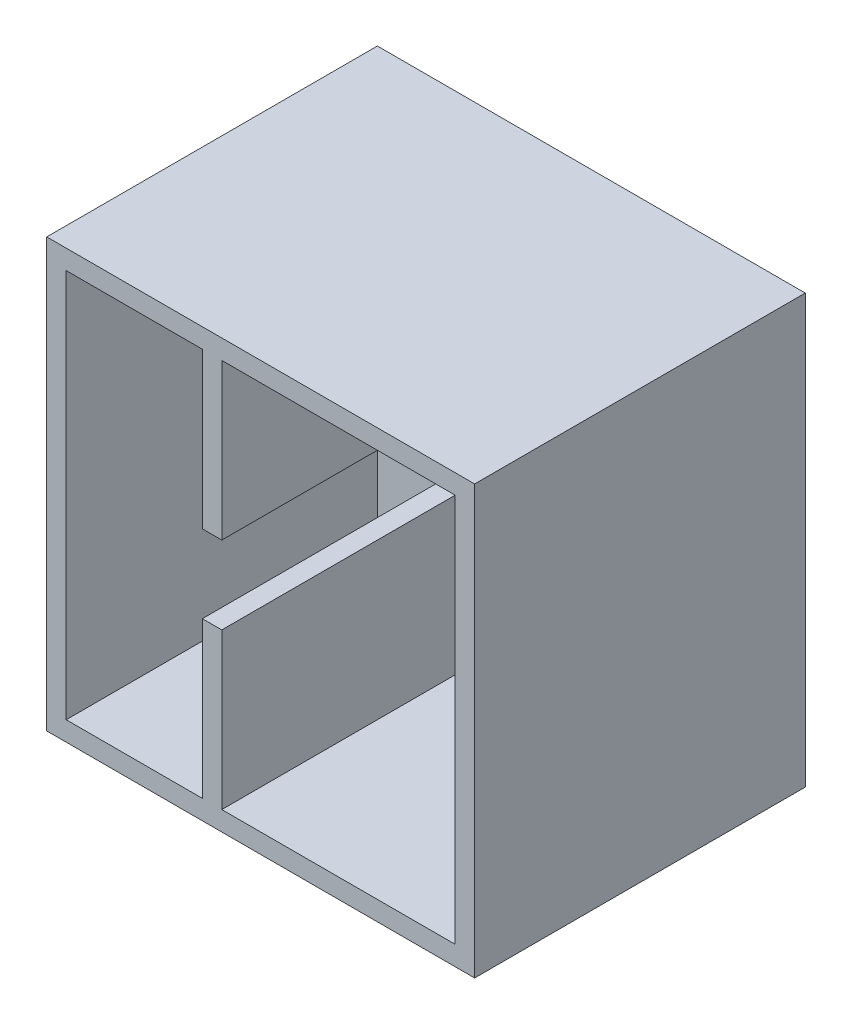
ISO-10303-21;
HEADER;
FILE_DESCRIPTION(('STEP AP214'),'2;1');
FILE_NAME('part.step','',(''),(''),'','','');
FILE_SCHEMA(('AUTOMOTIVE_DESIGN { 1 0 10303 214 1 1 1 1 }'));
ENDSEC;
DATA;
#1=APPLICATION_CONTEXT('core data for automotive mechanical design processes');
#2=APPLICATION_PROTOCOL_DEFINITION('international standard','automotive_design',2000,#1);
#3=PRODUCT_CONTEXT('',#1,'mechanical');
#4=PRODUCT('Part','Part','',(#3));
#5=PRODUCT_RELATED_PRODUCT_CATEGORY('part','',(#4));
#6=PRODUCT_DEFINITION_FORMATION('','',#4);
#7=PRODUCT_DEFINITION_CONTEXT('part definition',#1,'design');
#8=PRODUCT_DEFINITION('design','',#6,#7);
#9=PRODUCT_DEFINITION_SHAPE('','',#8);
#10=(LENGTH_UNIT() NAMED_UNIT(*) SI_UNIT(.MILLI.,.METRE.));
#11=(NAMED_UNIT(*) PLANE_ANGLE_UNIT() SI_UNIT($,.RADIAN.));
#12=(NAMED_UNIT(*) SI_UNIT($,.STERADIAN.) SOLID_ANGLE_UNIT());
#13=UNCERTAINTY_MEASURE_WITH_UNIT(LENGTH_MEASURE(1.E-05),#10,'distance_accuracy_value','');
#14=(GEOMETRIC_REPRESENTATION_CONTEXT(3) GLOBAL_UNCERTAINTY_ASSIGNED_CONTEXT((#13)) GLOBAL_UNIT_ASSIGNED_CONTEXT((#10,
#11,#12)) REPRESENTATION_CONTEXT('',''));
#15=CARTESIAN_POINT('',(0.,0.,0.));
#16=DIRECTION('',(0.,0.,1.));
#17=DIRECTION('',(1.,0.,0.));
#18=AXIS2_PLACEMENT_3D('',#15,#16,#17);
#19=CARTESIAN_POINT('',(-300.,1000.,1700.));
#20=DIRECTION('',(0.,-1.,0.));
#21=DIRECTION('',(0.,0.,-1.));
#22=AXIS2_PLACEMENT_3D('',#19,#20,#21);
#23=PLANE('',#22);
#24=DIRECTION('',(0.,0.,-1.));
#25=VECTOR('',#24,1.);
#26=CARTESIAN_POINT('',(-1000.,1000.,1700.));
#27=LINE('',#26,#25);
#28=CARTESIAN_POINT('',(-1000.,1000.,1700.));
#29=VERTEX_POINT('',#28);
#30=CARTESIAN_POINT('',(-1000.,1000.,100.));
#31=VERTEX_POINT('',#30);
#32=EDGE_CURVE('E153',#29,#31,#27,.T.);
#33=ORIENTED_EDGE('',*,*,#32,.T.);
#34=DIRECTION('',(1.,0.,0.));
#35=VECTOR('',#34,1.);
#36=CARTESIAN_POINT('',(-300.,1000.,100.));
#37=LINE('',#36,#35);
#38=CARTESIAN_POINT('',(-300.,1000.,100.));
#39=VERTEX_POINT('',#38);
#40=EDGE_CURVE('E144',#31,#39,#37,.T.);
#41=ORIENTED_EDGE('',*,*,#40,.T.);
#42=DIRECTION('',(0.,0.,-1.));
#43=VECTOR('',#42,1.);
#44=CARTESIAN_POINT('',(-300.,1000.,1700.));
#45=LINE('',#44,#43);
#46=CARTESIAN_POINT('',(-300.,1000.,1700.));
#47=VERTEX_POINT('',#46);
#48=EDGE_CURVE('E150',#47,#39,#45,.T.);
#49=ORIENTED_EDGE('',*,*,#48,.F.);
#50=DIRECTION('',(-1.,0.,0.));
#51=VECTOR('',#50,1.);
#52=CARTESIAN_POINT('',(-300.,1000.,1700.));
#53=LINE('',#52,#51);
#54=EDGE_CURVE('E154',#47,#29,#53,.T.);
#55=ORIENTED_EDGE('',*,*,#54,.T.);
#56=EDGE_LOOP('',(#33,#41,#49,#55));
#57=FACE_BOUND('',#56,.T.);
#58=ADVANCED_FACE('F33',(#57),#23,.T.);
#59=CARTESIAN_POINT('',(-1000.,-1000.,1700.));
#60=DIRECTION('',(1.,0.,0.));
#61=DIRECTION('',(0.,0.,-1.));
#62=AXIS2_PLACEMENT_3D('',#59,#60,#61);
#63=PLANE('',#62);
#64=DIRECTION('',(0.,0.,-1.));
#65=VECTOR('',#64,1.);
#66=CARTESIAN_POINT('',(-1000.,-1000.,1700.));
#67=LINE('',#66,#65);
#68=CARTESIAN_POINT('',(-1000.,-1000.,1700.));
#69=VERTEX_POINT('',#68);
#70=CARTESIAN_POINT('',(-1000.,-1000.,100.));
#71=VERTEX_POINT('',#70);
#72=EDGE_CURVE('E190',#69,#71,#67,.T.);
#73=ORIENTED_EDGE('',*,*,#72,.T.);
#74=DIRECTION('',(0.,1.,0.));
#75=VECTOR('',#74,1.);
#76=CARTESIAN_POINT('',(-1000.,-1000.,100.));
#77=LINE('',#76,#75);
#78=EDGE_CURVE('E155',#71,#31,#77,.T.);
#79=ORIENTED_EDGE('',*,*,#78,.T.);
#80=ORIENTED_EDGE('',*,*,#32,.F.);
#81=DIRECTION('',(0.,-1.,0.));
#82=VECTOR('',#81,1.);
#83=CARTESIAN_POINT('',(-1000.,-1000.,1700.));
#84=LINE('',#83,#82);
#85=EDGE_CURVE('E247',#29,#69,#84,.T.);
#86=ORIENTED_EDGE('',*,*,#85,.T.);
#87=EDGE_LOOP('',(#73,#79,#80,#86));
#88=FACE_BOUND('',#87,.T.);
#89=ADVANCED_FACE('F318',(#88),#63,.T.);
#90=CARTESIAN_POINT('',(-300.,-1000.,1700.));
#91=DIRECTION('',(0.,1.,0.));
#92=DIRECTION('',(-1.,0.,0.));
#93=AXIS2_PLACEMENT_3D('',#90,#91,#92);
#94=PLANE('',#93);
#95=DIRECTION('',(0.,0.,-1.));
#96=VECTOR('',#95,1.);
#97=CARTESIAN_POINT('',(-300.,-1000.,1700.));
#98=LINE('',#97,#96);
#99=CARTESIAN_POINT('',(-300.,-1000.,1700.));
#100=VERTEX_POINT('',#99);
#101=CARTESIAN_POINT('',(-300.,-1000.,100.));
#102=VERTEX_POINT('',#101);
#103=EDGE_CURVE('E187',#100,#102,#98,.T.);
#104=ORIENTED_EDGE('',*,*,#103,.T.);
#105=DIRECTION('',(-1.,0.,0.));
#106=VECTOR('',#105,1.);
#107=CARTESIAN_POINT('',(-300.,-1000.,100.));
#108=LINE('',#107,#106);
#109=EDGE_CURVE('E317',#102,#71,#108,.T.);
#110=ORIENTED_EDGE('',*,*,#109,.T.);
#111=ORIENTED_EDGE('',*,*,#72,.F.);
#112=DIRECTION('',(1.,0.,0.));
#113=VECTOR('',#112,1.);
#114=CARTESIAN_POINT('',(-300.,-1000.,1700.));
#115=LINE('',#114,#113);
#116=EDGE_CURVE('E249',#69,#100,#115,.T.);
#117=ORIENTED_EDGE('',*,*,#116,.T.);
#118=EDGE_LOOP('',(#104,#110,#111,#117));
#119=FACE_BOUND('',#118,.T.);
#120=ADVANCED_FACE('F316',(#119),#94,.T.);
#121=CARTESIAN_POINT('',(-300.,-1000.,1700.));
#122=DIRECTION('',(-1.,0.,0.));
#123=DIRECTION('',(0.,-1.,0.));
#124=AXIS2_PLACEMENT_3D('',#121,#122,#123);
#125=PLANE('',#124);
#126=DIRECTION('',(0.,0.,-1.));
#127=VECTOR('',#126,1.);
#128=CARTESIAN_POINT('',(-300.,-200.,1700.));
#129=LINE('',#128,#127);
#130=CARTESIAN_POINT('',(-300.,-200.,1700.));
#131=VERTEX_POINT('',#130);
#132=CARTESIAN_POINT('',(-300.,-200.,100.));
#133=VERTEX_POINT('',#132);
#134=EDGE_CURVE('E184',#131,#133,#129,.T.);
#135=ORIENTED_EDGE('',*,*,#134,.T.);
#136=DIRECTION('',(0.,-1.,0.));
#137=VECTOR('',#136,1.);
#138=CARTESIAN_POINT('',(-300.,-1000.,100.));
#139=LINE('',#138,#137);
#140=EDGE_CURVE('E313',#133,#102,#139,.T.);
#141=ORIENTED_EDGE('',*,*,#140,.T.);
#142=ORIENTED_EDGE('',*,*,#103,.F.);
#143=DIRECTION('',(0.,1.,0.));
#144=VECTOR('',#143,1.);
#145=CARTESIAN_POINT('',(-300.,-1000.,1700.));
#146=LINE('',#145,#144);
#147=EDGE_CURVE('E253',#100,#131,#146,.T.);
#148=ORIENTED_EDGE('',*,*,#147,.T.);
#149=EDGE_LOOP('',(#135,#141,#142,#148));
#150=FACE_BOUND('',#149,.T.);
#151=ADVANCED_FACE('F311',(#150),#125,.T.);
#152=CARTESIAN_POINT('',(-300.,-200.,1700.));
#153=DIRECTION('',(0.,1.,0.));
#154=DIRECTION('',(-1.,0.,0.));
#155=AXIS2_PLACEMENT_3D('',#152,#153,#154);
#156=PLANE('',#155);
#157=DIRECTION('',(0.,0.,-1.));
#158=VECTOR('',#157,1.);
#159=CARTESIAN_POINT('',(-200.,-200.,1700.));
#160=LINE('',#159,#158);
#161=CARTESIAN_POINT('',(-200.,-200.,1700.));
#162=VERTEX_POINT('',#161);
#163=CARTESIAN_POINT('',(-200.,-200.,100.));
#164=VERTEX_POINT('',#163);
#165=EDGE_CURVE('E181',#162,#164,#160,.T.);
#166=ORIENTED_EDGE('',*,*,#165,.T.);
#167=DIRECTION('',(-1.,0.,0.));
#168=VECTOR('',#167,1.);
#169=CARTESIAN_POINT('',(-300.,-200.,100.));
#170=LINE('',#169,#168);
#171=EDGE_CURVE('E308',#164,#133,#170,.T.);
#172=ORIENTED_EDGE('',*,*,#171,.T.);
#173=ORIENTED_EDGE('',*,*,#134,.F.);
#174=DIRECTION('',(1.,0.,0.));
#175=VECTOR('',#174,1.);
#176=CARTESIAN_POINT('',(-300.,-200.,1700.));
#177=LINE('',#176,#175);
#178=EDGE_CURVE('E258',#131,#162,#177,.T.);
#179=ORIENTED_EDGE('',*,*,#178,.T.);
#180=EDGE_LOOP('',(#166,#172,#173,#179));
#181=FACE_BOUND('',#180,.T.);
#182=ADVANCED_FACE('F306',(#181),#156,.T.);
#183=CARTESIAN_POINT('',(-200.,-200.,1700.));
#184=DIRECTION('',(1.,0.,0.));
#185=DIRECTION('',(0.,1.,0.));
#186=AXIS2_PLACEMENT_3D('',#183,#184,#185);
#187=PLANE('',#186);
#188=DIRECTION('',(0.,0.,-1.));
#189=VECTOR('',#188,1.);
#190=CARTESIAN_POINT('',(-200.,-1000.,1700.));
#191=LINE('',#190,#189);
#192=CARTESIAN_POINT('',(-200.,-1000.,1700.));
#193=VERTEX_POINT('',#192);
#194=CARTESIAN_POINT('',(-200.,-1000.,100.));
#195=VERTEX_POINT('',#194);
#196=EDGE_CURVE('E178',#193,#195,#191,.T.);
#197=ORIENTED_EDGE('',*,*,#196,.T.);
#198=DIRECTION('',(0.,1.,0.));
#199=VECTOR('',#198,1.);
#200=CARTESIAN_POINT('',(-200.,-200.,100.));
#201=LINE('',#200,#199);
#202=EDGE_CURVE('E303',#195,#164,#201,.T.);
#203=ORIENTED_EDGE('',*,*,#202,.T.);
#204=ORIENTED_EDGE('',*,*,#165,.F.);
#205=DIRECTION('',(0.,-1.,0.));
#206=VECTOR('',#205,1.);
#207=CARTESIAN_POINT('',(-200.,-200.,1700.));
#208=LINE('',#207,#206);
#209=EDGE_CURVE('E260',#162,#193,#208,.T.);
#210=ORIENTED_EDGE('',*,*,#209,.T.);
#211=EDGE_LOOP('',(#197,#203,#204,#210));
#212=FACE_BOUND('',#211,.T.);
#213=ADVANCED_FACE('F301',(#212),#187,.T.);
#214=CARTESIAN_POINT('',(1000.,-1000.,1700.));
#215=DIRECTION('',(0.,1.,0.));
#216=DIRECTION('',(-1.,0.,0.));
#217=AXIS2_PLACEMENT_3D('',#214,#215,#216);
#218=PLANE('',#217);
#219=DIRECTION('',(0.,0.,-1.));
#220=VECTOR('',#219,1.);
#221=CARTESIAN_POINT('',(1000.,-1000.,1700.));
#222=LINE('',#221,#220);
#223=CARTESIAN_POINT('',(1000.,-1000.,1700.));
#224=VERTEX_POINT('',#223);
#225=CARTESIAN_POINT('',(1000.,-1000.,100.));
#226=VERTEX_POINT('',#225);
#227=EDGE_CURVE('E175',#224,#226,#222,.T.);
#228=ORIENTED_EDGE('',*,*,#227,.T.);
#229=DIRECTION('',(-1.,0.,0.));
#230=VECTOR('',#229,1.);
#231=CARTESIAN_POINT('',(1000.,-1000.,100.));
#232=LINE('',#231,#230);
#233=EDGE_CURVE('E298',#226,#195,#232,.T.);
#234=ORIENTED_EDGE('',*,*,#233,.T.);
#235=ORIENTED_EDGE('',*,*,#196,.F.);
#236=DIRECTION('',(1.,0.,0.));
#237=VECTOR('',#236,1.);
#238=CARTESIAN_POINT('',(1000.,-1000.,1700.));
#239=LINE('',#238,#237);
#240=EDGE_CURVE('E262',#193,#224,#239,.T.);
#241=ORIENTED_EDGE('',*,*,#240,.T.);
#242=EDGE_LOOP('',(#228,#234,#235,#241));
#243=FACE_BOUND('',#242,.T.);
#244=ADVANCED_FACE('F296',(#243),#218,.T.);
#245=CARTESIAN_POINT('',(1000.,-1000.,1700.));
#246=DIRECTION('',(-1.,0.,0.));
#247=DIRECTION('',(0.,0.,1.));
#248=AXIS2_PLACEMENT_3D('',#245,#246,#247);
#249=PLANE('',#248);
#250=DIRECTION('',(0.,0.,-1.));
#251=VECTOR('',#250,1.);
#252=CARTESIAN_POINT('',(1000.,1000.,1700.));
#253=LINE('',#252,#251);
#254=CARTESIAN_POINT('',(1000.,1000.,1700.));
#255=VERTEX_POINT('',#254);
#256=CARTESIAN_POINT('',(1000.,1000.,100.));
#257=VERTEX_POINT('',#256);
#258=EDGE_CURVE('E172',#255,#257,#253,.T.);
#259=ORIENTED_EDGE('',*,*,#258,.T.);
#260=DIRECTION('',(0.,-1.,0.));
#261=VECTOR('',#260,1.);
#262=CARTESIAN_POINT('',(1000.,-1000.,100.));
#263=LINE('',#262,#261);
#264=EDGE_CURVE('E290',#257,#226,#263,.T.);
#265=ORIENTED_EDGE('',*,*,#264,.T.);
#266=ORIENTED_EDGE('',*,*,#227,.F.);
#267=DIRECTION('',(0.,1.,0.));
#268=VECTOR('',#267,1.);
#269=CARTESIAN_POINT('',(1000.,-1000.,1700.));
#270=LINE('',#269,#268);
#271=EDGE_CURVE('E264',#224,#255,#270,.T.);
#272=ORIENTED_EDGE('',*,*,#271,.T.);
#273=EDGE_LOOP('',(#259,#265,#266,#272));
#274=FACE_BOUND('',#273,.T.);
#275=ADVANCED_FACE('F288',(#274),#249,.T.);
#276=CARTESIAN_POINT('',(1000.,1000.,1700.));
#277=DIRECTION('',(0.,-1.,0.));
#278=DIRECTION('',(0.,0.,-1.));
#279=AXIS2_PLACEMENT_3D('',#276,#277,#278);
#280=PLANE('',#279);
#281=DIRECTION('',(0.,0.,-1.));
#282=VECTOR('',#281,1.);
#283=CARTESIAN_POINT('',(-200.,1000.,1700.));
#284=LINE('',#283,#282);
#285=CARTESIAN_POINT('',(-200.,1000.,1700.));
#286=VERTEX_POINT('',#285);
#287=CARTESIAN_POINT('',(-200.,1000.,100.));
#288=VERTEX_POINT('',#287);
#289=EDGE_CURVE('E169',#286,#288,#284,.T.);
#290=ORIENTED_EDGE('',*,*,#289,.T.);
#291=DIRECTION('',(1.,0.,0.));
#292=VECTOR('',#291,1.);
#293=CARTESIAN_POINT('',(1000.,1000.,100.));
#294=LINE('',#293,#292);
#295=EDGE_CURVE('E285',#288,#257,#294,.T.);
#296=ORIENTED_EDGE('',*,*,#295,.T.);
#297=ORIENTED_EDGE('',*,*,#258,.F.);
#298=DIRECTION('',(-1.,0.,0.));
#299=VECTOR('',#298,1.);
#300=CARTESIAN_POINT('',(1000.,1000.,1700.));
#301=LINE('',#300,#299);
#302=EDGE_CURVE('E266',#255,#286,#301,.T.);
#303=ORIENTED_EDGE('',*,*,#302,.T.);
#304=EDGE_LOOP('',(#290,#296,#297,#303));
#305=FACE_BOUND('',#304,.T.);
#306=ADVANCED_FACE('F283',(#305),#280,.T.);
#307=CARTESIAN_POINT('',(-200.,200.,1700.));
#308=DIRECTION('',(1.,0.,0.));
#309=DIRECTION('',(0.,1.,0.));
#310=AXIS2_PLACEMENT_3D('',#307,#308,#309);
#311=PLANE('',#310);
#312=DIRECTION('',(0.,0.,-1.));
#313=VECTOR('',#312,1.);
#314=CARTESIAN_POINT('',(-200.,200.,1700.));
#315=LINE('',#314,#313);
#316=CARTESIAN_POINT('',(-200.,200.,1700.));
#317=VERTEX_POINT('',#316);
#318=CARTESIAN_POINT('',(-200.,200.,100.));
#319=VERTEX_POINT('',#318);
#320=EDGE_CURVE('E161',#317,#319,#315,.T.);
#321=ORIENTED_EDGE('',*,*,#320,.T.);
#322=DIRECTION('',(0.,1.,0.));
#323=VECTOR('',#322,1.);
#324=CARTESIAN_POINT('',(-200.,200.,100.));
#325=LINE('',#324,#323);
#326=EDGE_CURVE('E280',#319,#288,#325,.T.);
#327=ORIENTED_EDGE('',*,*,#326,.T.);
#328=ORIENTED_EDGE('',*,*,#289,.F.);
#329=DIRECTION('',(0.,-1.,0.));
#330=VECTOR('',#329,1.);
#331=CARTESIAN_POINT('',(-200.,200.,1700.));
#332=LINE('',#331,#330);
#333=EDGE_CURVE('E268',#286,#317,#332,.T.);
#334=ORIENTED_EDGE('',*,*,#333,.T.);
#335=EDGE_LOOP('',(#321,#327,#328,#334));
#336=FACE_BOUND('',#335,.T.);
#337=ADVANCED_FACE('F278',(#336),#311,.T.);
#338=CARTESIAN_POINT('',(-300.,200.,1700.));
#339=DIRECTION('',(0.,-1.,0.));
#340=DIRECTION('',(1.,0.,0.));
#341=AXIS2_PLACEMENT_3D('',#338,#339,#340);
#342=PLANE('',#341);
#343=DIRECTION('',(0.,0.,-1.));
#344=VECTOR('',#343,1.);
#345=CARTESIAN_POINT('',(-300.,200.,1700.));
#346=LINE('',#345,#344);
#347=CARTESIAN_POINT('',(-300.,200.,1700.));
#348=VERTEX_POINT('',#347);
#349=CARTESIAN_POINT('',(-300.,200.,100.));
#350=VERTEX_POINT('',#349);
#351=EDGE_CURVE('E54',#348,#350,#346,.T.);
#352=ORIENTED_EDGE('',*,*,#351,.T.);
#353=DIRECTION('',(1.,0.,0.));
#354=VECTOR('',#353,1.);
#355=CARTESIAN_POINT('',(-300.,200.,100.));
#356=LINE('',#355,#354);
#357=EDGE_CURVE('E48',#350,#319,#356,.T.);
#358=ORIENTED_EDGE('',*,*,#357,.T.);
#359=ORIENTED_EDGE('',*,*,#320,.F.);
#360=DIRECTION('',(-1.,0.,0.));
#361=VECTOR('',#360,1.);
#362=CARTESIAN_POINT('',(-300.,200.,1700.));
#363=LINE('',#362,#361);
#364=EDGE_CURVE('E163',#317,#348,#363,.T.);
#365=ORIENTED_EDGE('',*,*,#364,.T.);
#366=EDGE_LOOP('',(#352,#358,#359,#365));
#367=FACE_BOUND('',#366,.T.);
#368=ADVANCED_FACE('F272',(#367),#342,.T.);
#369=CARTESIAN_POINT('',(-300.,1000.,1700.));
#370=DIRECTION('',(-1.,0.,0.));
#371=DIRECTION('',(0.,-1.,0.));
#372=AXIS2_PLACEMENT_3D('',#369,#370,#371);
#373=PLANE('',#372);
#374=ORIENTED_EDGE('',*,*,#48,.T.);
#375=DIRECTION('',(0.,-1.,0.));
#376=VECTOR('',#375,1.);
#377=CARTESIAN_POINT('',(-300.,1000.,100.));
#378=LINE('',#377,#376);
#379=EDGE_CURVE('E11',#39,#350,#378,.T.);
#380=ORIENTED_EDGE('',*,*,#379,.T.);
#381=ORIENTED_EDGE('',*,*,#351,.F.);
#382=DIRECTION('',(0.,1.,0.));
#383=VECTOR('',#382,1.);
#384=CARTESIAN_POINT('',(-300.,1000.,1700.));
#385=LINE('',#384,#383);
#386=EDGE_CURVE('E159',#348,#47,#385,.T.);
#387=ORIENTED_EDGE('',*,*,#386,.T.);
#388=EDGE_LOOP('',(#374,#380,#381,#387));
#389=FACE_BOUND('',#388,.T.);
#390=ADVANCED_FACE('F157',(#389),#373,.T.);
#391=CARTESIAN_POINT('',(0.,0.,1700.));
#392=DIRECTION('',(0.,0.,1.));
#393=DIRECTION('',(1.,0.,0.));
#394=AXIS2_PLACEMENT_3D('',#391,#392,#393);
#395=PLANE('',#394);
#396=DIRECTION('',(0.,1.,0.));
#397=VECTOR('',#396,1.);
#398=CARTESIAN_POINT('',(1100.,-1100.,1700.));
#399=LINE('',#398,#397);
#400=CARTESIAN_POINT('',(1100.,-1100.,1700.));
#401=VERTEX_POINT('',#400);
#402=CARTESIAN_POINT('',(1100.,1100.,1700.));
#403=VERTEX_POINT('',#402);
#404=EDGE_CURVE('E195',#401,#403,#399,.T.);
#405=ORIENTED_EDGE('',*,*,#404,.T.);
#406=DIRECTION('',(-1.,0.,0.));
#407=VECTOR('',#406,1.);
#408=CARTESIAN_POINT('',(1100.,1100.,1700.));
#409=LINE('',#408,#407);
#410=CARTESIAN_POINT('',(-1100.,1100.,1700.));
#411=VERTEX_POINT('',#410);
#412=EDGE_CURVE('E198',#403,#411,#409,.T.);
#413=ORIENTED_EDGE('',*,*,#412,.T.);
#414=DIRECTION('',(0.,-1.,0.));
#415=VECTOR('',#414,1.);
#416=CARTESIAN_POINT('',(-1100.,-1100.,1700.));
#417=LINE('',#416,#415);
#418=CARTESIAN_POINT('',(-1100.,-1100.,1700.));
#419=VERTEX_POINT('',#418);
#420=EDGE_CURVE('E201',#411,#419,#417,.T.);
#421=ORIENTED_EDGE('',*,*,#420,.T.);
#422=DIRECTION('',(1.,0.,0.));
#423=VECTOR('',#422,1.);
#424=CARTESIAN_POINT('',(1100.,-1100.,1700.));
#425=LINE('',#424,#423);
#426=EDGE_CURVE('E203',#419,#401,#425,.T.);
#427=ORIENTED_EDGE('',*,*,#426,.T.);
#428=EDGE_LOOP('',(#405,#413,#421,#427));
#429=FACE_BOUND('',#428,.T.);
#430=ORIENTED_EDGE('',*,*,#85,.F.);
#431=ORIENTED_EDGE('',*,*,#54,.F.);
#432=ORIENTED_EDGE('',*,*,#386,.F.);
#433=ORIENTED_EDGE('',*,*,#364,.F.);
#434=ORIENTED_EDGE('',*,*,#333,.F.);
#435=ORIENTED_EDGE('',*,*,#302,.F.);
#436=ORIENTED_EDGE('',*,*,#271,.F.);
#437=ORIENTED_EDGE('',*,*,#240,.F.);
#438=ORIENTED_EDGE('',*,*,#209,.F.);
#439=ORIENTED_EDGE('',*,*,#178,.F.);
#440=ORIENTED_EDGE('',*,*,#147,.F.);
#441=ORIENTED_EDGE('',*,*,#116,.F.);
#442=EDGE_LOOP('',(#430,#431,#432,#433,#434,#435,#436,#437,#438,#439,#440,#441));
#443=FACE_BOUND('',#442,.T.);
#444=ADVANCED_FACE('F241',(#429,#443),#395,.T.);
#445=CARTESIAN_POINT('',(0.,0.,0.));
#446=DIRECTION('',(0.,0.,1.));
#447=DIRECTION('',(1.,0.,0.));
#448=AXIS2_PLACEMENT_3D('',#445,#446,#447);
#449=PLANE('',#448);
#450=DIRECTION('',(0.,1.,0.));
#451=VECTOR('',#450,1.);
#452=CARTESIAN_POINT('',(1100.,-1100.,0.));
#453=LINE('',#452,#451);
#454=CARTESIAN_POINT('',(1100.,-1100.,0.));
#455=VERTEX_POINT('',#454);
#456=CARTESIAN_POINT('',(1100.,1100.,0.));
#457=VERTEX_POINT('',#456);
#458=EDGE_CURVE('E194',#455,#457,#453,.T.);
#459=ORIENTED_EDGE('',*,*,#458,.F.);
#460=DIRECTION('',(1.,0.,0.));
#461=VECTOR('',#460,1.);
#462=CARTESIAN_POINT('',(1100.,-1100.,0.));
#463=LINE('',#462,#461);
#464=CARTESIAN_POINT('',(-1100.,-1100.,0.));
#465=VERTEX_POINT('',#464);
#466=EDGE_CURVE('E199',#465,#455,#463,.T.);
#467=ORIENTED_EDGE('',*,*,#466,.F.);
#468=DIRECTION('',(0.,-1.,0.));
#469=VECTOR('',#468,1.);
#470=CARTESIAN_POINT('',(-1100.,-1100.,0.));
#471=LINE('',#470,#469);
#472=CARTESIAN_POINT('',(-1100.,1100.,0.));
#473=VERTEX_POINT('',#472);
#474=EDGE_CURVE('E211',#473,#465,#471,.T.);
#475=ORIENTED_EDGE('',*,*,#474,.F.);
#476=DIRECTION('',(-1.,0.,0.));
#477=VECTOR('',#476,1.);
#478=CARTESIAN_POINT('',(1100.,1100.,0.));
#479=LINE('',#478,#477);
#480=EDGE_CURVE('E208',#457,#473,#479,.T.);
#481=ORIENTED_EDGE('',*,*,#480,.F.);
#482=EDGE_LOOP('',(#459,#467,#475,#481));
#483=FACE_BOUND('',#482,.T.);
#484=ADVANCED_FACE('F230',(#483),#449,.F.);
#485=CARTESIAN_POINT('',(1100.,-1100.,1700.));
#486=DIRECTION('',(-1.,0.,0.));
#487=DIRECTION('',(0.,0.,1.));
#488=AXIS2_PLACEMENT_3D('',#485,#486,#487);
#489=PLANE('',#488);
#490=ORIENTED_EDGE('',*,*,#458,.T.);
#491=DIRECTION('',(0.,0.,-1.));
#492=VECTOR('',#491,1.);
#493=CARTESIAN_POINT('',(1100.,1100.,1700.));
#494=LINE('',#493,#492);
#495=EDGE_CURVE('E41',#403,#457,#494,.T.);
#496=ORIENTED_EDGE('',*,*,#495,.F.);
#497=ORIENTED_EDGE('',*,*,#404,.F.);
#498=DIRECTION('',(0.,0.,-1.));
#499=VECTOR('',#498,1.);
#500=CARTESIAN_POINT('',(1100.,-1100.,1700.));
#501=LINE('',#500,#499);
#502=EDGE_CURVE('E205',#401,#455,#501,.T.);
#503=ORIENTED_EDGE('',*,*,#502,.T.);
#504=EDGE_LOOP('',(#490,#496,#497,#503));
#505=FACE_BOUND('',#504,.T.);
#506=ADVANCED_FACE('F35',(#505),#489,.F.);
#507=CARTESIAN_POINT('',(1100.,1100.,1700.));
#508=DIRECTION('',(0.,-1.,0.));
#509=DIRECTION('',(1.,0.,0.));
#510=AXIS2_PLACEMENT_3D('',#507,#508,#509);
#511=PLANE('',#510);
#512=ORIENTED_EDGE('',*,*,#480,.T.);
#513=DIRECTION('',(0.,0.,-1.));
#514=VECTOR('',#513,1.);
#515=CARTESIAN_POINT('',(-1100.,1100.,1700.));
#516=LINE('',#515,#514);
#517=EDGE_CURVE('E219',#411,#473,#516,.T.);
#518=ORIENTED_EDGE('',*,*,#517,.F.);
#519=ORIENTED_EDGE('',*,*,#412,.F.);
#520=ORIENTED_EDGE('',*,*,#495,.T.);
#521=EDGE_LOOP('',(#512,#518,#519,#520));
#522=FACE_BOUND('',#521,.T.);
#523=ADVANCED_FACE('F223',(#522),#511,.F.);
#524=CARTESIAN_POINT('',(-1100.,-1100.,1700.));
#525=DIRECTION('',(1.,0.,0.));
#526=DIRECTION('',(0.,0.,-1.));
#527=AXIS2_PLACEMENT_3D('',#524,#525,#526);
#528=PLANE('',#527);
#529=ORIENTED_EDGE('',*,*,#474,.T.);
#530=DIRECTION('',(0.,0.,-1.));
#531=VECTOR('',#530,1.);
#532=CARTESIAN_POINT('',(-1100.,-1100.,1700.));
#533=LINE('',#532,#531);
#534=EDGE_CURVE('E217',#419,#465,#533,.T.);
#535=ORIENTED_EDGE('',*,*,#534,.F.);
#536=ORIENTED_EDGE('',*,*,#420,.F.);
#537=ORIENTED_EDGE('',*,*,#517,.T.);
#538=EDGE_LOOP('',(#529,#535,#536,#537));
#539=FACE_BOUND('',#538,.T.);
#540=ADVANCED_FACE('F239',(#539),#528,.F.);
#541=CARTESIAN_POINT('',(1100.,-1100.,1700.));
#542=DIRECTION('',(0.,1.,0.));
#543=DIRECTION('',(-1.,0.,0.));
#544=AXIS2_PLACEMENT_3D('',#541,#542,#543);
#545=PLANE('',#544);
#546=ORIENTED_EDGE('',*,*,#466,.T.);
#547=ORIENTED_EDGE('',*,*,#502,.F.);
#548=ORIENTED_EDGE('',*,*,#426,.F.);
#549=ORIENTED_EDGE('',*,*,#534,.T.);
#550=EDGE_LOOP('',(#546,#547,#548,#549));
#551=FACE_BOUND('',#550,.T.);
#552=ADVANCED_FACE('F235',(#551),#545,.F.);
#553=CARTESIAN_POINT('',(0.,0.,100.));
#554=DIRECTION('',(0.,0.,-1.));
#555=DIRECTION('',(-1.,0.,0.));
#556=AXIS2_PLACEMENT_3D('',#553,#554,#555);
#557=PLANE('',#556);
#558=ORIENTED_EDGE('',*,*,#40,.F.);
#559=ORIENTED_EDGE('',*,*,#78,.F.);
#560=ORIENTED_EDGE('',*,*,#109,.F.);
#561=ORIENTED_EDGE('',*,*,#140,.F.);
#562=ORIENTED_EDGE('',*,*,#171,.F.);
#563=ORIENTED_EDGE('',*,*,#202,.F.);
#564=ORIENTED_EDGE('',*,*,#233,.F.);
#565=ORIENTED_EDGE('',*,*,#264,.F.);
#566=ORIENTED_EDGE('',*,*,#295,.F.);
#567=ORIENTED_EDGE('',*,*,#326,.F.);
#568=ORIENTED_EDGE('',*,*,#357,.F.);
#569=ORIENTED_EDGE('',*,*,#379,.F.);
#570=EDGE_LOOP('',(#558,#559,#560,#561,#562,#563,#564,#565,#566,#567,#568,#569));
#571=FACE_BOUND('',#570,.T.);
#572=ADVANCED_FACE('F143',(#571),#557,.F.);
#573=CLOSED_SHELL('',(#58,#89,#120,#151,#182,#213,#244,#275,#306,#337,#368,#390,#444,#484,#506,
#523,#540,#552,#572));
#574=MANIFOLD_SOLID_BREP('B2',#573);
#575=ADVANCED_BREP_SHAPE_REPRESENTATION('',(#18,#574),#14);
#576=SHAPE_DEFINITION_REPRESENTATION(#9,#575);
ENDSEC;
END-ISO-10303-21;
